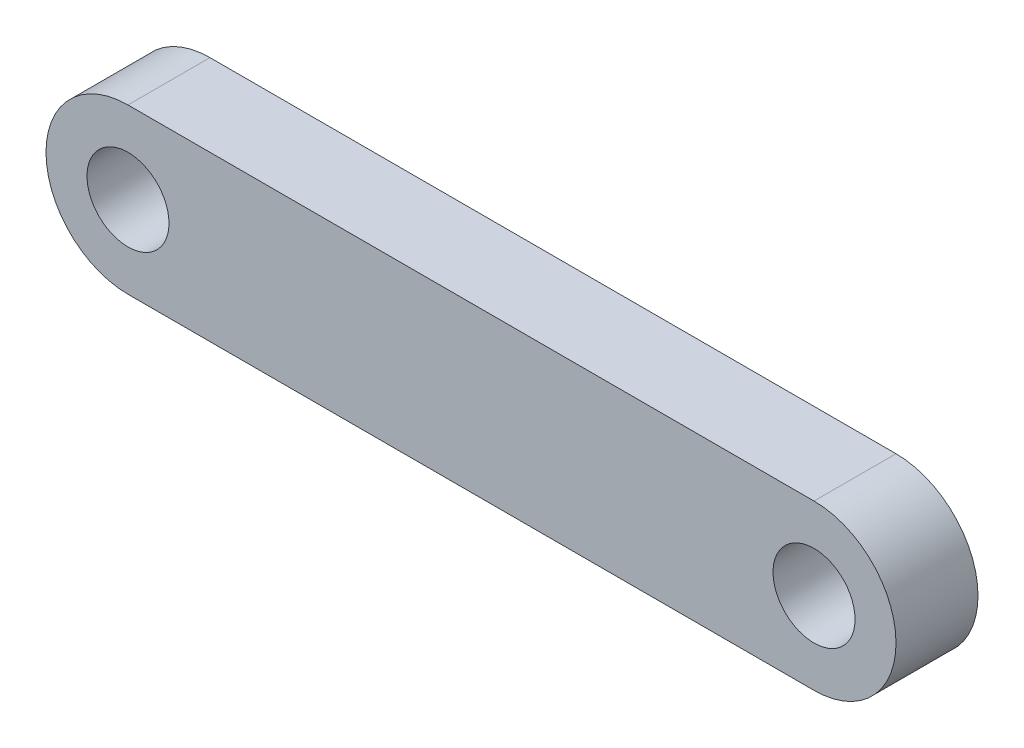
ISO-10303-21;
HEADER;
FILE_DESCRIPTION(('STEP AP214'),'2;1');
FILE_NAME('part.step','',(''),(''),'','','');
FILE_SCHEMA(('AUTOMOTIVE_DESIGN { 1 0 10303 214 1 1 1 1 }'));
ENDSEC;
DATA;
#1=APPLICATION_CONTEXT('core data for automotive mechanical design processes');
#2=APPLICATION_PROTOCOL_DEFINITION('international standard','automotive_design',2000,#1);
#3=PRODUCT_CONTEXT('',#1,'mechanical');
#4=PRODUCT('Part','Part','',(#3));
#5=PRODUCT_RELATED_PRODUCT_CATEGORY('part','',(#4));
#6=PRODUCT_DEFINITION_FORMATION('','',#4);
#7=PRODUCT_DEFINITION_CONTEXT('part definition',#1,'design');
#8=PRODUCT_DEFINITION('design','',#6,#7);
#9=PRODUCT_DEFINITION_SHAPE('','',#8);
#10=(LENGTH_UNIT() NAMED_UNIT(*) SI_UNIT(.MILLI.,.METRE.));
#11=(NAMED_UNIT(*) PLANE_ANGLE_UNIT() SI_UNIT($,.RADIAN.));
#12=(NAMED_UNIT(*) SI_UNIT($,.STERADIAN.) SOLID_ANGLE_UNIT());
#13=UNCERTAINTY_MEASURE_WITH_UNIT(LENGTH_MEASURE(1.E-05),#10,'distance_accuracy_value','');
#14=(GEOMETRIC_REPRESENTATION_CONTEXT(3) GLOBAL_UNCERTAINTY_ASSIGNED_CONTEXT((#13)) GLOBAL_UNIT_ASSIGNED_CONTEXT((#10,
#11,#12)) REPRESENTATION_CONTEXT('',''));
#15=CARTESIAN_POINT('',(0.,0.,0.));
#16=DIRECTION('',(0.,0.,1.));
#17=DIRECTION('',(1.,0.,0.));
#18=AXIS2_PLACEMENT_3D('',#15,#16,#17);
#19=CARTESIAN_POINT('',(20.92,0.,5.));
#20=DIRECTION('',(0.,0.,-1.));
#21=DIRECTION('',(-1.,0.,0.));
#22=AXIS2_PLACEMENT_3D('',#19,#20,#21);
#23=PLANE('',#22);
#24=CARTESIAN_POINT('',(20.92,0.,5.));
#25=DIRECTION('',(0.,0.,1.));
#26=DIRECTION('',(-1.,0.,0.));
#27=AXIS2_PLACEMENT_3D('',#24,#25,#26);
#28=CIRCLE('',#27,5.00000000000001);
#29=CARTESIAN_POINT('',(20.92,-5.00000000000001,5.));
#30=VERTEX_POINT('',#29);
#31=CARTESIAN_POINT('',(20.92,5.00000000000001,5.));
#32=VERTEX_POINT('',#31);
#33=EDGE_CURVE('E96',#30,#32,#28,.T.);
#34=ORIENTED_EDGE('',*,*,#33,.T.);
#35=DIRECTION('',(-1.,0.,0.));
#36=VECTOR('',#35,1.);
#37=CARTESIAN_POINT('',(-20.92,5.,5.));
#38=LINE('',#37,#36);
#39=CARTESIAN_POINT('',(-20.92,5.,5.));
#40=VERTEX_POINT('',#39);
#41=EDGE_CURVE('E91',#32,#40,#38,.T.);
#42=ORIENTED_EDGE('',*,*,#41,.T.);
#43=CARTESIAN_POINT('',(-20.92,0.,5.));
#44=DIRECTION('',(0.,0.,1.));
#45=DIRECTION('',(1.,0.,0.));
#46=AXIS2_PLACEMENT_3D('',#43,#44,#45);
#47=CIRCLE('',#46,5.00000000000001);
#48=CARTESIAN_POINT('',(-20.92,-5.00000000000002,5.));
#49=VERTEX_POINT('',#48);
#50=EDGE_CURVE('E94',#40,#49,#47,.T.);
#51=ORIENTED_EDGE('',*,*,#50,.T.);
#52=DIRECTION('',(1.,0.,0.));
#53=VECTOR('',#52,1.);
#54=CARTESIAN_POINT('',(-20.92,-5.00000000000002,5.));
#55=LINE('',#54,#53);
#56=EDGE_CURVE('E61',#49,#30,#55,.T.);
#57=ORIENTED_EDGE('',*,*,#56,.T.);
#58=EDGE_LOOP('',(#34,#42,#51,#57));
#59=FACE_BOUND('',#58,.T.);
#60=CARTESIAN_POINT('',(-20.92,0.,5.));
#61=DIRECTION('',(0.,0.,1.));
#62=DIRECTION('',(1.,0.,0.));
#63=AXIS2_PLACEMENT_3D('',#60,#61,#62);
#64=CIRCLE('',#63,2.5);
#65=CARTESIAN_POINT('',(-18.42,0.,5.));
#66=VERTEX_POINT('',#65);
#67=EDGE_CURVE('E116',#66,#66,#64,.T.);
#68=ORIENTED_EDGE('',*,*,#67,.F.);
#69=EDGE_LOOP('',(#68));
#70=FACE_BOUND('',#69,.T.);
#71=CARTESIAN_POINT('',(20.92,0.,5.));
#72=DIRECTION('',(0.,0.,1.));
#73=DIRECTION('',(1.,0.,0.));
#74=AXIS2_PLACEMENT_3D('',#71,#72,#73);
#75=CIRCLE('',#74,2.5);
#76=CARTESIAN_POINT('',(23.42,0.,5.));
#77=VERTEX_POINT('',#76);
#78=EDGE_CURVE('E138',#77,#77,#75,.T.);
#79=ORIENTED_EDGE('',*,*,#78,.F.);
#80=EDGE_LOOP('',(#79));
#81=FACE_BOUND('',#80,.T.);
#82=ADVANCED_FACE('F43',(#59,#70,#81),#23,.F.);
#83=CARTESIAN_POINT('',(20.92,0.,0.));
#84=DIRECTION('',(0.,0.,-1.));
#85=DIRECTION('',(-1.,0.,0.));
#86=AXIS2_PLACEMENT_3D('',#83,#84,#85);
#87=PLANE('',#86);
#88=CARTESIAN_POINT('',(-20.92,0.,0.));
#89=DIRECTION('',(0.,0.,1.));
#90=DIRECTION('',(1.,0.,0.));
#91=AXIS2_PLACEMENT_3D('',#88,#89,#90);
#92=CIRCLE('',#91,2.5);
#93=CARTESIAN_POINT('',(-18.42,0.,0.));
#94=VERTEX_POINT('',#93);
#95=EDGE_CURVE('E134',#94,#94,#92,.T.);
#96=ORIENTED_EDGE('',*,*,#95,.T.);
#97=EDGE_LOOP('',(#96));
#98=FACE_BOUND('',#97,.T.);
#99=CARTESIAN_POINT('',(20.92,0.,0.));
#100=DIRECTION('',(0.,0.,1.));
#101=DIRECTION('',(-1.,0.,0.));
#102=AXIS2_PLACEMENT_3D('',#99,#100,#101);
#103=CIRCLE('',#102,5.00000000000001);
#104=CARTESIAN_POINT('',(20.92,-5.00000000000001,0.));
#105=VERTEX_POINT('',#104);
#106=CARTESIAN_POINT('',(20.92,5.00000000000001,0.));
#107=VERTEX_POINT('',#106);
#108=EDGE_CURVE('E112',#105,#107,#103,.T.);
#109=ORIENTED_EDGE('',*,*,#108,.F.);
#110=DIRECTION('',(1.,0.,0.));
#111=VECTOR('',#110,1.);
#112=CARTESIAN_POINT('',(-20.92,-5.00000000000002,0.));
#113=LINE('',#112,#111);
#114=CARTESIAN_POINT('',(-20.92,-5.00000000000002,0.));
#115=VERTEX_POINT('',#114);
#116=EDGE_CURVE('E84',#115,#105,#113,.T.);
#117=ORIENTED_EDGE('',*,*,#116,.F.);
#118=CARTESIAN_POINT('',(-20.92,0.,0.));
#119=DIRECTION('',(0.,0.,1.));
#120=DIRECTION('',(1.,0.,0.));
#121=AXIS2_PLACEMENT_3D('',#118,#119,#120);
#122=CIRCLE('',#121,5.00000000000001);
#123=CARTESIAN_POINT('',(-20.92,5.,0.));
#124=VERTEX_POINT('',#123);
#125=EDGE_CURVE('E78',#124,#115,#122,.T.);
#126=ORIENTED_EDGE('',*,*,#125,.F.);
#127=DIRECTION('',(-1.,0.,0.));
#128=VECTOR('',#127,1.);
#129=CARTESIAN_POINT('',(-20.92,5.,0.));
#130=LINE('',#129,#128);
#131=EDGE_CURVE('E101',#107,#124,#130,.T.);
#132=ORIENTED_EDGE('',*,*,#131,.F.);
#133=EDGE_LOOP('',(#109,#117,#126,#132));
#134=FACE_BOUND('',#133,.T.);
#135=CARTESIAN_POINT('',(20.92,0.,0.));
#136=DIRECTION('',(0.,0.,1.));
#137=DIRECTION('',(1.,0.,0.));
#138=AXIS2_PLACEMENT_3D('',#135,#136,#137);
#139=CIRCLE('',#138,2.5);
#140=CARTESIAN_POINT('',(23.42,0.,0.));
#141=VERTEX_POINT('',#140);
#142=EDGE_CURVE('E142',#141,#141,#139,.T.);
#143=ORIENTED_EDGE('',*,*,#142,.T.);
#144=EDGE_LOOP('',(#143));
#145=FACE_BOUND('',#144,.T.);
#146=ADVANCED_FACE('F129',(#98,#134,#145),#87,.T.);
#147=CARTESIAN_POINT('',(20.92,0.,5.));
#148=DIRECTION('',(0.,0.,-1.));
#149=DIRECTION('',(-1.,0.,0.));
#150=AXIS2_PLACEMENT_3D('',#147,#148,#149);
#151=CYLINDRICAL_SURFACE('',#150,5.00000000000001);
#152=ORIENTED_EDGE('',*,*,#108,.T.);
#153=DIRECTION('',(0.,0.,-1.));
#154=VECTOR('',#153,1.);
#155=CARTESIAN_POINT('',(20.92,5.00000000000001,5.));
#156=LINE('',#155,#154);
#157=EDGE_CURVE('E11',#32,#107,#156,.T.);
#158=ORIENTED_EDGE('',*,*,#157,.F.);
#159=ORIENTED_EDGE('',*,*,#33,.F.);
#160=DIRECTION('',(0.,0.,-1.));
#161=VECTOR('',#160,1.);
#162=CARTESIAN_POINT('',(20.92,-5.00000000000001,5.));
#163=LINE('',#162,#161);
#164=EDGE_CURVE('E108',#30,#105,#163,.T.);
#165=ORIENTED_EDGE('',*,*,#164,.T.);
#166=EDGE_LOOP('',(#152,#158,#159,#165));
#167=FACE_BOUND('',#166,.T.);
#168=ADVANCED_FACE('F45',(#167),#151,.T.);
#169=CARTESIAN_POINT('',(-20.92,5.,5.));
#170=DIRECTION('',(0.,-1.,0.));
#171=DIRECTION('',(1.,0.,0.));
#172=AXIS2_PLACEMENT_3D('',#169,#170,#171);
#173=PLANE('',#172);
#174=ORIENTED_EDGE('',*,*,#131,.T.);
#175=DIRECTION('',(0.,0.,-1.));
#176=VECTOR('',#175,1.);
#177=CARTESIAN_POINT('',(-20.92,5.,5.));
#178=LINE('',#177,#176);
#179=EDGE_CURVE('E53',#40,#124,#178,.T.);
#180=ORIENTED_EDGE('',*,*,#179,.F.);
#181=ORIENTED_EDGE('',*,*,#41,.F.);
#182=ORIENTED_EDGE('',*,*,#157,.T.);
#183=EDGE_LOOP('',(#174,#180,#181,#182));
#184=FACE_BOUND('',#183,.T.);
#185=ADVANCED_FACE('F100',(#184),#173,.F.);
#186=CARTESIAN_POINT('',(-20.92,0.,5.));
#187=DIRECTION('',(0.,0.,-1.));
#188=DIRECTION('',(-1.,0.,0.));
#189=AXIS2_PLACEMENT_3D('',#186,#187,#188);
#190=CYLINDRICAL_SURFACE('',#189,5.00000000000001);
#191=ORIENTED_EDGE('',*,*,#125,.T.);
#192=DIRECTION('',(0.,0.,-1.));
#193=VECTOR('',#192,1.);
#194=CARTESIAN_POINT('',(-20.92,-5.00000000000002,5.));
#195=LINE('',#194,#193);
#196=EDGE_CURVE('E103',#49,#115,#195,.T.);
#197=ORIENTED_EDGE('',*,*,#196,.F.);
#198=ORIENTED_EDGE('',*,*,#50,.F.);
#199=ORIENTED_EDGE('',*,*,#179,.T.);
#200=EDGE_LOOP('',(#191,#197,#198,#199));
#201=FACE_BOUND('',#200,.T.);
#202=ADVANCED_FACE('F104',(#201),#190,.T.);
#203=CARTESIAN_POINT('',(-20.92,-5.00000000000002,5.));
#204=DIRECTION('',(0.,1.,0.));
#205=DIRECTION('',(-1.,0.,0.));
#206=AXIS2_PLACEMENT_3D('',#203,#204,#205);
#207=PLANE('',#206);
#208=ORIENTED_EDGE('',*,*,#116,.T.);
#209=ORIENTED_EDGE('',*,*,#164,.F.);
#210=ORIENTED_EDGE('',*,*,#56,.F.);
#211=ORIENTED_EDGE('',*,*,#196,.T.);
#212=EDGE_LOOP('',(#208,#209,#210,#211));
#213=FACE_BOUND('',#212,.T.);
#214=ADVANCED_FACE('F126',(#213),#207,.F.);
#215=CARTESIAN_POINT('',(-20.92,0.,5.));
#216=DIRECTION('',(0.,0.,-1.));
#217=DIRECTION('',(-1.,0.,0.));
#218=AXIS2_PLACEMENT_3D('',#215,#216,#217);
#219=CYLINDRICAL_SURFACE('',#218,2.5);
#220=ORIENTED_EDGE('',*,*,#67,.T.);
#221=EDGE_LOOP('',(#220));
#222=FACE_BOUND('',#221,.T.);
#223=ORIENTED_EDGE('',*,*,#95,.F.);
#224=EDGE_LOOP('',(#223));
#225=FACE_BOUND('',#224,.T.);
#226=ADVANCED_FACE('F161',(#222,#225),#219,.F.);
#227=CARTESIAN_POINT('',(20.92,0.,5.));
#228=DIRECTION('',(0.,0.,-1.));
#229=DIRECTION('',(-1.,0.,0.));
#230=AXIS2_PLACEMENT_3D('',#227,#228,#229);
#231=CYLINDRICAL_SURFACE('',#230,2.5);
#232=ORIENTED_EDGE('',*,*,#78,.T.);
#233=EDGE_LOOP('',(#232));
#234=FACE_BOUND('',#233,.T.);
#235=ORIENTED_EDGE('',*,*,#142,.F.);
#236=EDGE_LOOP('',(#235));
#237=FACE_BOUND('',#236,.T.);
#238=ADVANCED_FACE('F150',(#234,#237),#231,.F.);
#239=CLOSED_SHELL('',(#82,#146,#168,#185,#202,#214,#226,#238));
#240=MANIFOLD_SOLID_BREP('B2',#239);
#241=ADVANCED_BREP_SHAPE_REPRESENTATION('',(#18,#240),#14);
#242=SHAPE_DEFINITION_REPRESENTATION(#9,#241);
ENDSEC;
END-ISO-10303-21;
